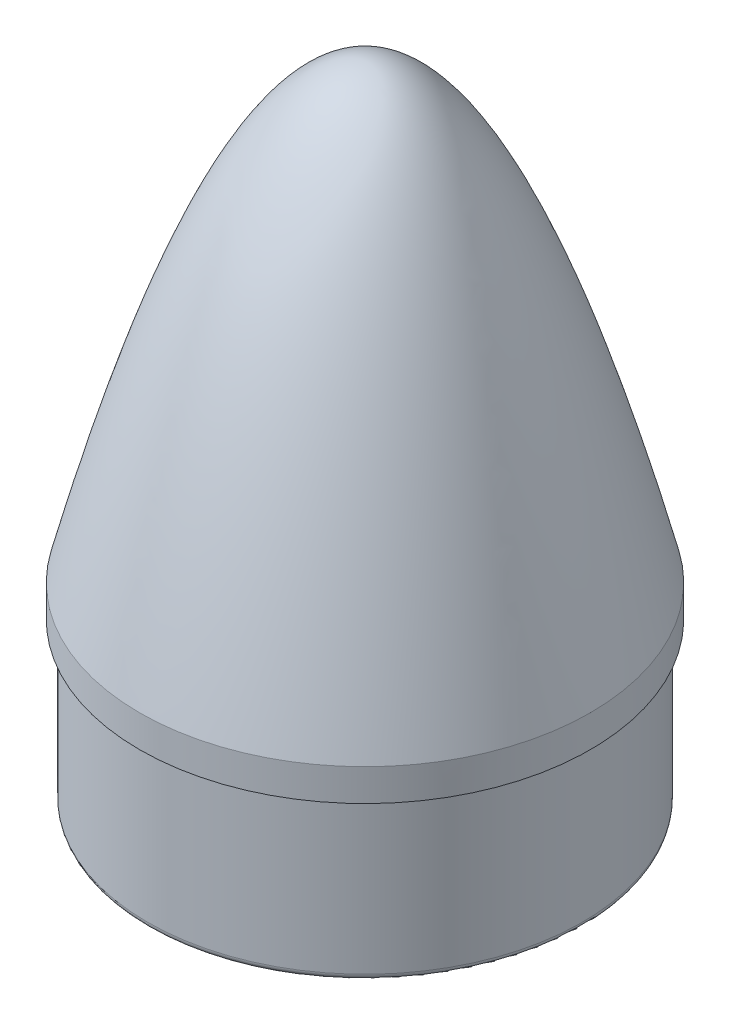
ISO-10303-21;
HEADER;
FILE_DESCRIPTION(('STEP AP214'),'2;1');
FILE_NAME('part.step','',(''),(''),'','','');
FILE_SCHEMA(('AUTOMOTIVE_DESIGN { 1 0 10303 214 1 1 1 1 }'));
ENDSEC;
DATA;
#1=APPLICATION_CONTEXT('core data for automotive mechanical design processes');
#2=APPLICATION_PROTOCOL_DEFINITION('international standard','automotive_design',2000,#1);
#3=PRODUCT_CONTEXT('',#1,'mechanical');
#4=PRODUCT('Part','Part','',(#3));
#5=PRODUCT_RELATED_PRODUCT_CATEGORY('part','',(#4));
#6=PRODUCT_DEFINITION_FORMATION('','',#4);
#7=PRODUCT_DEFINITION_CONTEXT('part definition',#1,'design');
#8=PRODUCT_DEFINITION('design','',#6,#7);
#9=PRODUCT_DEFINITION_SHAPE('','',#8);
#10=(LENGTH_UNIT() NAMED_UNIT(*) SI_UNIT(.MILLI.,.METRE.));
#11=(NAMED_UNIT(*) PLANE_ANGLE_UNIT() SI_UNIT($,.RADIAN.));
#12=(NAMED_UNIT(*) SI_UNIT($,.STERADIAN.) SOLID_ANGLE_UNIT());
#13=UNCERTAINTY_MEASURE_WITH_UNIT(LENGTH_MEASURE(1.E-05),#10,'distance_accuracy_value','');
#14=(GEOMETRIC_REPRESENTATION_CONTEXT(3) GLOBAL_UNCERTAINTY_ASSIGNED_CONTEXT((#13)) GLOBAL_UNIT_ASSIGNED_CONTEXT((#10,
#11,#12)) REPRESENTATION_CONTEXT('',''));
#15=CARTESIAN_POINT('',(0.,0.,0.));
#16=DIRECTION('',(0.,0.,1.));
#17=DIRECTION('',(1.,0.,0.));
#18=AXIS2_PLACEMENT_3D('',#15,#16,#17);
#19=CARTESIAN_POINT('',(0.,-58.0000000943207,0.));
#20=DIRECTION('',(0.,1.,0.));
#21=DIRECTION('',(0.,0.,1.));
#22=AXIS2_PLACEMENT_3D('',#19,#20,#21);
#23=TOROIDAL_SURFACE('',#22,66.,2.);
#24=CARTESIAN_POINT('',(0.,-58.0000000943207,0.));
#25=DIRECTION('',(0.,1.,0.));
#26=DIRECTION('',(0.,0.,1.));
#27=AXIS2_PLACEMENT_3D('',#24,#25,#26);
#28=CIRCLE('',#27,68.);
#29=CARTESIAN_POINT('',(0.,-58.0000000943207,68.));
#30=VERTEX_POINT('',#29);
#31=EDGE_CURVE('E63',#30,#30,#28,.T.);
#32=ORIENTED_EDGE('',*,*,#31,.F.);
#33=EDGE_LOOP('',(#32));
#34=FACE_BOUND('',#33,.T.);
#35=CARTESIAN_POINT('',(0.,-60.0000000943207,0.));
#36=DIRECTION('',(0.,1.,0.));
#37=DIRECTION('',(0.,0.,1.));
#38=AXIS2_PLACEMENT_3D('',#35,#36,#37);
#39=CIRCLE('',#38,66.);
#40=CARTESIAN_POINT('',(0.,-60.0000000943207,66.));
#41=VERTEX_POINT('',#40);
#42=EDGE_CURVE('E11',#41,#41,#39,.T.);
#43=ORIENTED_EDGE('',*,*,#42,.T.);
#44=EDGE_LOOP('',(#43));
#45=FACE_BOUND('',#44,.T.);
#46=ADVANCED_FACE('F38',(#34,#45),#23,.T.);
#47=CARTESIAN_POINT('',(66.,-60.0000000943207,0.));
#48=DIRECTION('',(0.,1.,0.));
#49=DIRECTION('',(0.,0.,1.));
#50=AXIS2_PLACEMENT_3D('',#47,#48,#49);
#51=PLANE('',#50);
#52=ORIENTED_EDGE('',*,*,#42,.F.);
#53=EDGE_LOOP('',(#52));
#54=FACE_BOUND('',#53,.T.);
#55=ADVANCED_FACE('F51',(#54),#51,.F.);
#56=CARTESIAN_POINT('',(70.4999998133534,-9.47406805784645E-08,0.));
#57=CARTESIAN_POINT('',(35.2500000001574,140.999999953259,0.));
#58=CARTESIAN_POINT('',(1.27068494615301E-13,141.,0.));
#59=B_SPLINE_CURVE_WITH_KNOTS('',2,(#56,#57,#58),.UNSPECIFIED.,.F.,.F.,(3,3),(0.086579459689564,
0.952374056589022),.UNSPECIFIED.);
#60=CARTESIAN_POINT('',(0.,141.,0.));
#61=DIRECTION('',(0.,1.,0.));
#62=AXIS1_PLACEMENT('',#60,#61);
#63=SURFACE_OF_REVOLUTION('',#59,#62);
#64=CARTESIAN_POINT('',(1.27068494615301E-13,141.,0.));
#65=VERTEX_POINT('',#64);
#66=VERTEX_LOOP('',#65);
#67=FACE_BOUND('',#66,.T.);
#68=CARTESIAN_POINT('',(0.,-9.43206901471427E-08,0.));
#69=DIRECTION('',(0.,1.,0.));
#70=DIRECTION('',(0.,0.,1.));
#71=AXIS2_PLACEMENT_3D('',#68,#69,#70);
#72=CIRCLE('',#71,70.4999998132484);
#73=CARTESIAN_POINT('',(0.,-9.43206901471427E-08,70.4999998132484));
#74=VERTEX_POINT('',#73);
#75=EDGE_CURVE('E44',#74,#74,#72,.T.);
#76=ORIENTED_EDGE('',*,*,#75,.T.);
#77=EDGE_LOOP('',(#76));
#78=FACE_BOUND('',#77,.T.);
#79=ADVANCED_FACE('F47',(#67,#78),#63,.T.);
#80=CARTESIAN_POINT('',(0.,141.,0.));
#81=DIRECTION('',(0.,1.,0.));
#82=DIRECTION('',(0.,0.,1.));
#83=AXIS2_PLACEMENT_3D('',#80,#81,#82);
#84=CYLINDRICAL_SURFACE('',#83,70.4999998132484);
#85=ORIENTED_EDGE('',*,*,#75,.F.);
#86=EDGE_LOOP('',(#85));
#87=FACE_BOUND('',#86,.T.);
#88=CARTESIAN_POINT('',(0.,-10.0000000943207,0.));
#89=DIRECTION('',(0.,1.,0.));
#90=DIRECTION('',(0.,0.,1.));
#91=AXIS2_PLACEMENT_3D('',#88,#89,#90);
#92=CIRCLE('',#91,70.4999998132484);
#93=CARTESIAN_POINT('',(0.,-10.0000000943207,70.4999998132484));
#94=VERTEX_POINT('',#93);
#95=EDGE_CURVE('E56',#94,#94,#92,.T.);
#96=ORIENTED_EDGE('',*,*,#95,.T.);
#97=EDGE_LOOP('',(#96));
#98=FACE_BOUND('',#97,.T.);
#99=ADVANCED_FACE('F50',(#87,#98),#84,.T.);
#100=CARTESIAN_POINT('',(70.4999998132484,-10.0000000943207,0.));
#101=DIRECTION('',(0.,1.,0.));
#102=DIRECTION('',(0.,0.,1.));
#103=AXIS2_PLACEMENT_3D('',#100,#101,#102);
#104=PLANE('',#103);
#105=ORIENTED_EDGE('',*,*,#95,.F.);
#106=EDGE_LOOP('',(#105));
#107=FACE_BOUND('',#106,.T.);
#108=CARTESIAN_POINT('',(0.,-10.0000000943207,0.));
#109=DIRECTION('',(0.,1.,0.));
#110=DIRECTION('',(0.,0.,1.));
#111=AXIS2_PLACEMENT_3D('',#108,#109,#110);
#112=CIRCLE('',#111,68.);
#113=CARTESIAN_POINT('',(0.,-10.0000000943207,68.));
#114=VERTEX_POINT('',#113);
#115=EDGE_CURVE('E58',#114,#114,#112,.T.);
#116=ORIENTED_EDGE('',*,*,#115,.T.);
#117=EDGE_LOOP('',(#116));
#118=FACE_BOUND('',#117,.T.);
#119=ADVANCED_FACE('F88',(#107,#118),#104,.F.);
#120=CARTESIAN_POINT('',(0.,141.,0.));
#121=DIRECTION('',(0.,1.,0.));
#122=DIRECTION('',(0.,0.,1.));
#123=AXIS2_PLACEMENT_3D('',#120,#121,#122);
#124=CYLINDRICAL_SURFACE('',#123,68.);
#125=ORIENTED_EDGE('',*,*,#115,.F.);
#126=EDGE_LOOP('',(#125));
#127=FACE_BOUND('',#126,.T.);
#128=ORIENTED_EDGE('',*,*,#31,.T.);
#129=EDGE_LOOP('',(#128));
#130=FACE_BOUND('',#129,.T.);
#131=ADVANCED_FACE('F86',(#127,#130),#124,.T.);
#132=CLOSED_SHELL('',(#46,#55,#79,#99,#119,#131));
#133=MANIFOLD_SOLID_BREP('B2',#132);
#134=ADVANCED_BREP_SHAPE_REPRESENTATION('',(#18,#133),#14);
#135=SHAPE_DEFINITION_REPRESENTATION(#9,#134);
ENDSEC;
END-ISO-10303-21;
